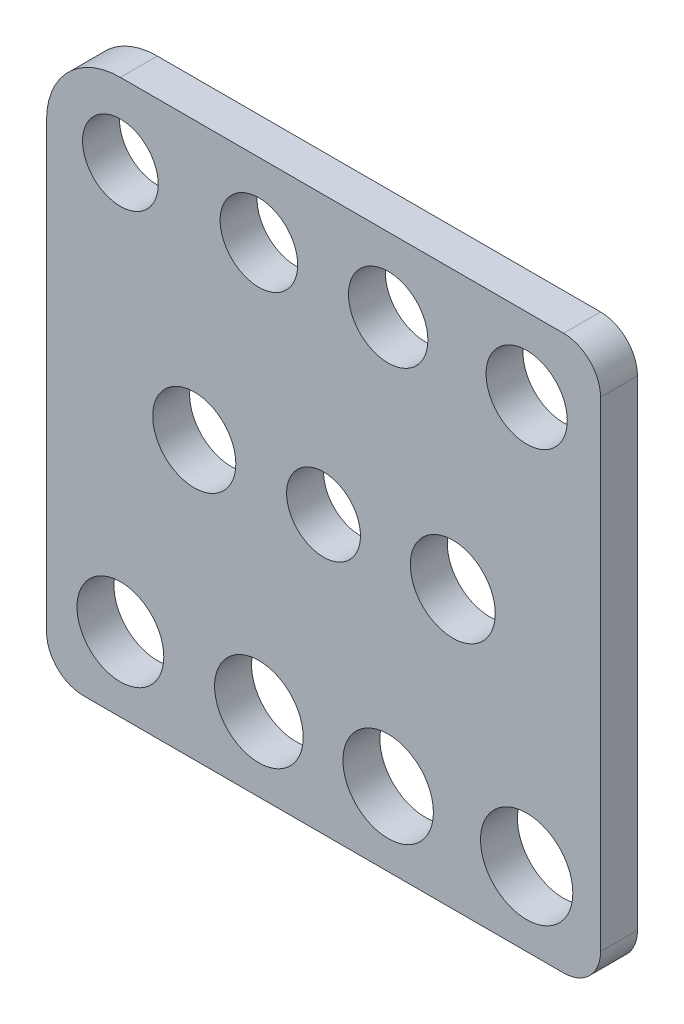
ISO-10303-21;
HEADER;
FILE_DESCRIPTION(('STEP AP214'),'2;1');
FILE_NAME('part.step','',(''),(''),'','','');
FILE_SCHEMA(('AUTOMOTIVE_DESIGN { 1 0 10303 214 1 1 1 1 }'));
ENDSEC;
DATA;
#1=APPLICATION_CONTEXT('core data for automotive mechanical design processes');
#2=APPLICATION_PROTOCOL_DEFINITION('international standard','automotive_design',2000,#1);
#3=PRODUCT_CONTEXT('',#1,'mechanical');
#4=PRODUCT('Part','Part','',(#3));
#5=PRODUCT_RELATED_PRODUCT_CATEGORY('part','',(#4));
#6=PRODUCT_DEFINITION_FORMATION('','',#4);
#7=PRODUCT_DEFINITION_CONTEXT('part definition',#1,'design');
#8=PRODUCT_DEFINITION('design','',#6,#7);
#9=PRODUCT_DEFINITION_SHAPE('','',#8);
#10=(LENGTH_UNIT() NAMED_UNIT(*) SI_UNIT(.MILLI.,.METRE.));
#11=(NAMED_UNIT(*) PLANE_ANGLE_UNIT() SI_UNIT($,.RADIAN.));
#12=(NAMED_UNIT(*) SI_UNIT($,.STERADIAN.) SOLID_ANGLE_UNIT());
#13=UNCERTAINTY_MEASURE_WITH_UNIT(LENGTH_MEASURE(1.E-05),#10,'distance_accuracy_value','');
#14=(GEOMETRIC_REPRESENTATION_CONTEXT(3) GLOBAL_UNCERTAINTY_ASSIGNED_CONTEXT((#13)) GLOBAL_UNIT_ASSIGNED_CONTEXT((#10,
#11,#12)) REPRESENTATION_CONTEXT('',''));
#15=CARTESIAN_POINT('',(0.,0.,0.));
#16=DIRECTION('',(0.,0.,1.));
#17=DIRECTION('',(1.,0.,0.));
#18=AXIS2_PLACEMENT_3D('',#15,#16,#17);
#19=CARTESIAN_POINT('',(-84.9572624856877,43.7175924462661,2.));
#20=DIRECTION('',(0.,0.,-1.));
#21=DIRECTION('',(-1.,0.,0.));
#22=AXIS2_PLACEMENT_3D('',#19,#20,#21);
#23=PLANE('',#22);
#24=CARTESIAN_POINT('',(-84.9572624856877,43.7175924462661,2.));
#25=DIRECTION('',(0.,0.,1.));
#26=DIRECTION('',(-1.,0.,0.));
#27=AXIS2_PLACEMENT_3D('',#24,#25,#26);
#28=CIRCLE('',#27,4.);
#29=CARTESIAN_POINT('',(-84.9572624856877,47.7175924462661,2.));
#30=VERTEX_POINT('',#29);
#31=CARTESIAN_POINT('',(-88.9572624856877,43.7175924462661,2.));
#32=VERTEX_POINT('',#31);
#33=EDGE_CURVE('E145',#30,#32,#28,.T.);
#34=ORIENTED_EDGE('',*,*,#33,.T.);
#35=DIRECTION('',(0.,-1.,0.));
#36=VECTOR('',#35,1.);
#37=CARTESIAN_POINT('',(-88.9572624856877,43.7175924462661,2.));
#38=LINE('',#37,#36);
#39=CARTESIAN_POINT('',(-88.9572624856877,19.7175924462661,2.));
#40=VERTEX_POINT('',#39);
#41=EDGE_CURVE('E93',#32,#40,#38,.T.);
#42=ORIENTED_EDGE('',*,*,#41,.T.);
#43=CARTESIAN_POINT('',(-86.9572624856877,19.7175924462661,2.));
#44=DIRECTION('',(0.,0.,1.));
#45=DIRECTION('',(1.,0.,0.));
#46=AXIS2_PLACEMENT_3D('',#43,#44,#45);
#47=CIRCLE('',#46,1.99999999999999);
#48=CARTESIAN_POINT('',(-86.9572624856877,17.7175924462661,2.));
#49=VERTEX_POINT('',#48);
#50=EDGE_CURVE('E160',#40,#49,#47,.T.);
#51=ORIENTED_EDGE('',*,*,#50,.T.);
#52=DIRECTION('',(1.,0.,0.));
#53=VECTOR('',#52,1.);
#54=CARTESIAN_POINT('',(-86.9572624856877,17.7175924462661,2.));
#55=LINE('',#54,#53);
#56=CARTESIAN_POINT('',(-60.9572624856877,17.7175924462661,2.));
#57=VERTEX_POINT('',#56);
#58=EDGE_CURVE('E173',#49,#57,#55,.T.);
#59=ORIENTED_EDGE('',*,*,#58,.T.);
#60=CARTESIAN_POINT('',(-60.9572624856877,19.7175924462661,2.));
#61=DIRECTION('',(0.,0.,1.));
#62=DIRECTION('',(1.,0.,0.));
#63=AXIS2_PLACEMENT_3D('',#60,#61,#62);
#64=CIRCLE('',#63,2.00000000000001);
#65=CARTESIAN_POINT('',(-58.9572624856877,19.7175924462661,2.));
#66=VERTEX_POINT('',#65);
#67=EDGE_CURVE('E112',#57,#66,#64,.T.);
#68=ORIENTED_EDGE('',*,*,#67,.T.);
#69=DIRECTION('',(0.,1.,0.));
#70=VECTOR('',#69,1.);
#71=CARTESIAN_POINT('',(-58.9572624856877,45.7175924462661,2.));
#72=LINE('',#71,#70);
#73=CARTESIAN_POINT('',(-58.9572624856877,45.7175924462661,2.));
#74=VERTEX_POINT('',#73);
#75=EDGE_CURVE('E106',#66,#74,#72,.T.);
#76=ORIENTED_EDGE('',*,*,#75,.T.);
#77=CARTESIAN_POINT('',(-60.9572624856877,45.7175924462661,2.));
#78=DIRECTION('',(0.,0.,1.));
#79=DIRECTION('',(-1.,0.,0.));
#80=AXIS2_PLACEMENT_3D('',#77,#78,#79);
#81=CIRCLE('',#80,2.00000000000001);
#82=CARTESIAN_POINT('',(-60.9572624856877,47.7175924462661,2.));
#83=VERTEX_POINT('',#82);
#84=EDGE_CURVE('E110',#74,#83,#81,.T.);
#85=ORIENTED_EDGE('',*,*,#84,.T.);
#86=DIRECTION('',(-1.,0.,0.));
#87=VECTOR('',#86,1.);
#88=CARTESIAN_POINT('',(-84.9572624856877,47.7175924462661,2.));
#89=LINE('',#88,#87);
#90=EDGE_CURVE('E50',#83,#30,#89,.T.);
#91=ORIENTED_EDGE('',*,*,#90,.T.);
#92=EDGE_LOOP('',(#34,#42,#51,#59,#68,#76,#85,#91));
#93=FACE_BOUND('',#92,.T.);
#94=CARTESIAN_POINT('',(-62.9572624856877,43.7175924462661,2.));
#95=DIRECTION('',(0.,0.,1.));
#96=DIRECTION('',(1.,0.,0.));
#97=AXIS2_PLACEMENT_3D('',#94,#95,#96);
#98=CIRCLE('',#97,2.2);
#99=CARTESIAN_POINT('',(-60.7572624856877,43.7175924462661,2.));
#100=VERTEX_POINT('',#99);
#101=EDGE_CURVE('E134',#100,#100,#98,.T.);
#102=ORIENTED_EDGE('',*,*,#101,.F.);
#103=EDGE_LOOP('',(#102));
#104=FACE_BOUND('',#103,.T.);
#105=CARTESIAN_POINT('',(-62.9572624856877,21.7175924462661,2.));
#106=DIRECTION('',(0.,0.,1.));
#107=DIRECTION('',(1.,0.,0.));
#108=AXIS2_PLACEMENT_3D('',#105,#106,#107);
#109=CIRCLE('',#108,2.49999999999999);
#110=CARTESIAN_POINT('',(-60.4572624856877,21.7175924462661,2.));
#111=VERTEX_POINT('',#110);
#112=EDGE_CURVE('E182',#111,#111,#109,.T.);
#113=ORIENTED_EDGE('',*,*,#112,.F.);
#114=EDGE_LOOP('',(#113));
#115=FACE_BOUND('',#114,.T.);
#116=CARTESIAN_POINT('',(-84.9572624856877,21.7175924462661,2.));
#117=DIRECTION('',(0.,0.,1.));
#118=DIRECTION('',(1.,0.,0.));
#119=AXIS2_PLACEMENT_3D('',#116,#117,#118);
#120=CIRCLE('',#119,2.35);
#121=CARTESIAN_POINT('',(-82.6072624856877,21.7175924462661,2.));
#122=VERTEX_POINT('',#121);
#123=EDGE_CURVE('E188',#122,#122,#120,.T.);
#124=ORIENTED_EDGE('',*,*,#123,.F.);
#125=EDGE_LOOP('',(#124));
#126=FACE_BOUND('',#125,.T.);
#127=CARTESIAN_POINT('',(-84.9572624856877,43.7175924462661,2.));
#128=DIRECTION('',(0.,0.,1.));
#129=DIRECTION('',(1.,0.,0.));
#130=AXIS2_PLACEMENT_3D('',#127,#128,#129);
#131=CIRCLE('',#130,2.04999999999999);
#132=CARTESIAN_POINT('',(-82.9072624856877,43.7175924462661,2.));
#133=VERTEX_POINT('',#132);
#134=EDGE_CURVE('E194',#133,#133,#131,.T.);
#135=ORIENTED_EDGE('',*,*,#134,.F.);
#136=EDGE_LOOP('',(#135));
#137=FACE_BOUND('',#136,.T.);
#138=CARTESIAN_POINT('',(-77.4572635149065,43.7215216040309,2.));
#139=DIRECTION('',(0.,0.,1.));
#140=DIRECTION('',(1.,0.,0.));
#141=AXIS2_PLACEMENT_3D('',#138,#139,#140);
#142=CIRCLE('',#141,2.1);
#143=CARTESIAN_POINT('',(-75.3572635149065,43.7215216040309,2.));
#144=VERTEX_POINT('',#143);
#145=EDGE_CURVE('E200',#144,#144,#142,.T.);
#146=ORIENTED_EDGE('',*,*,#145,.F.);
#147=EDGE_LOOP('',(#146));
#148=FACE_BOUND('',#147,.T.);
#149=CARTESIAN_POINT('',(-70.4572611381888,43.7220882756085,2.));
#150=DIRECTION('',(0.,0.,1.));
#151=DIRECTION('',(1.,0.,0.));
#152=AXIS2_PLACEMENT_3D('',#149,#150,#151);
#153=CIRCLE('',#152,2.15);
#154=CARTESIAN_POINT('',(-68.3072611381888,43.7220882756085,2.));
#155=VERTEX_POINT('',#154);
#156=EDGE_CURVE('E206',#155,#155,#153,.T.);
#157=ORIENTED_EDGE('',*,*,#156,.F.);
#158=EDGE_LOOP('',(#157));
#159=FACE_BOUND('',#158,.T.);
#160=CARTESIAN_POINT('',(-77.4572635149065,21.7215216040309,2.));
#161=DIRECTION('',(0.,0.,1.));
#162=DIRECTION('',(1.,0.,0.));
#163=AXIS2_PLACEMENT_3D('',#160,#161,#162);
#164=CIRCLE('',#163,2.4);
#165=CARTESIAN_POINT('',(-75.0572635149065,21.7215216040309,2.));
#166=VERTEX_POINT('',#165);
#167=EDGE_CURVE('E212',#166,#166,#164,.T.);
#168=ORIENTED_EDGE('',*,*,#167,.F.);
#169=EDGE_LOOP('',(#168));
#170=FACE_BOUND('',#169,.T.);
#171=CARTESIAN_POINT('',(-70.4572611381888,21.7220882756085,2.));
#172=DIRECTION('',(0.,0.,1.));
#173=DIRECTION('',(1.,0.,0.));
#174=AXIS2_PLACEMENT_3D('',#171,#172,#173);
#175=CIRCLE('',#174,2.45);
#176=CARTESIAN_POINT('',(-68.0072611381888,21.7220882756085,2.));
#177=VERTEX_POINT('',#176);
#178=EDGE_CURVE('E218',#177,#177,#175,.T.);
#179=ORIENTED_EDGE('',*,*,#178,.F.);
#180=EDGE_LOOP('',(#179));
#181=FACE_BOUND('',#180,.T.);
#182=CARTESIAN_POINT('',(-80.9572624856877,32.7175924462661,2.));
#183=DIRECTION('',(0.,0.,1.));
#184=DIRECTION('',(1.,0.,0.));
#185=AXIS2_PLACEMENT_3D('',#182,#183,#184);
#186=CIRCLE('',#185,2.25);
#187=CARTESIAN_POINT('',(-78.7072624856877,32.7175924462661,2.));
#188=VERTEX_POINT('',#187);
#189=EDGE_CURVE('E224',#188,#188,#186,.T.);
#190=ORIENTED_EDGE('',*,*,#189,.F.);
#191=EDGE_LOOP('',(#190));
#192=FACE_BOUND('',#191,.T.);
#193=CARTESIAN_POINT('',(-66.9572624856877,32.7175924462661,2.));
#194=DIRECTION('',(0.,0.,1.));
#195=DIRECTION('',(1.,0.,0.));
#196=AXIS2_PLACEMENT_3D('',#193,#194,#195);
#197=CIRCLE('',#196,2.29999999999999);
#198=CARTESIAN_POINT('',(-64.6572624856877,32.7175924462661,2.));
#199=VERTEX_POINT('',#198);
#200=EDGE_CURVE('E230',#199,#199,#197,.T.);
#201=ORIENTED_EDGE('',*,*,#200,.F.);
#202=EDGE_LOOP('',(#201));
#203=FACE_BOUND('',#202,.T.);
#204=CARTESIAN_POINT('',(-73.9572624856877,32.7175924462661,2.));
#205=DIRECTION('',(0.,0.,1.));
#206=DIRECTION('',(1.,0.,0.));
#207=AXIS2_PLACEMENT_3D('',#204,#205,#206);
#208=CIRCLE('',#207,2.);
#209=CARTESIAN_POINT('',(-71.9572624856877,32.7175924462661,2.));
#210=VERTEX_POINT('',#209);
#211=EDGE_CURVE('E236',#210,#210,#208,.T.);
#212=ORIENTED_EDGE('',*,*,#211,.F.);
#213=EDGE_LOOP('',(#212));
#214=FACE_BOUND('',#213,.T.);
#215=ADVANCED_FACE('F33',(#93,#104,#115,#126,#137,#148,#159,#170,#181,#192,#203,#214),#23,.F.);
#216=CARTESIAN_POINT('',(-84.9572624856877,43.7175924462661,0.));
#217=DIRECTION('',(0.,0.,-1.));
#218=DIRECTION('',(-1.,0.,0.));
#219=AXIS2_PLACEMENT_3D('',#216,#217,#218);
#220=PLANE('',#219);
#221=CARTESIAN_POINT('',(-66.9572624856877,32.7175924462661,0.));
#222=DIRECTION('',(0.,0.,1.));
#223=DIRECTION('',(1.,0.,0.));
#224=AXIS2_PLACEMENT_3D('',#221,#222,#223);
#225=CIRCLE('',#224,2.29999999999999);
#226=CARTESIAN_POINT('',(-64.6572624856877,32.7175924462661,0.));
#227=VERTEX_POINT('',#226);
#228=EDGE_CURVE('E233',#227,#227,#225,.T.);
#229=ORIENTED_EDGE('',*,*,#228,.T.);
#230=EDGE_LOOP('',(#229));
#231=FACE_BOUND('',#230,.T.);
#232=CARTESIAN_POINT('',(-70.4572611381888,21.7220882756085,0.));
#233=DIRECTION('',(0.,0.,1.));
#234=DIRECTION('',(1.,0.,0.));
#235=AXIS2_PLACEMENT_3D('',#232,#233,#234);
#236=CIRCLE('',#235,2.45);
#237=CARTESIAN_POINT('',(-68.0072611381888,21.7220882756085,0.));
#238=VERTEX_POINT('',#237);
#239=EDGE_CURVE('E221',#238,#238,#236,.T.);
#240=ORIENTED_EDGE('',*,*,#239,.T.);
#241=EDGE_LOOP('',(#240));
#242=FACE_BOUND('',#241,.T.);
#243=CARTESIAN_POINT('',(-70.4572611381888,43.7220882756085,0.));
#244=DIRECTION('',(0.,0.,1.));
#245=DIRECTION('',(1.,0.,0.));
#246=AXIS2_PLACEMENT_3D('',#243,#244,#245);
#247=CIRCLE('',#246,2.15);
#248=CARTESIAN_POINT('',(-68.3072611381888,43.7220882756085,0.));
#249=VERTEX_POINT('',#248);
#250=EDGE_CURVE('E209',#249,#249,#247,.T.);
#251=ORIENTED_EDGE('',*,*,#250,.T.);
#252=EDGE_LOOP('',(#251));
#253=FACE_BOUND('',#252,.T.);
#254=CARTESIAN_POINT('',(-84.9572624856877,43.7175924462661,0.));
#255=DIRECTION('',(0.,0.,1.));
#256=DIRECTION('',(1.,0.,0.));
#257=AXIS2_PLACEMENT_3D('',#254,#255,#256);
#258=CIRCLE('',#257,2.04999999999999);
#259=CARTESIAN_POINT('',(-82.9072624856877,43.7175924462661,0.));
#260=VERTEX_POINT('',#259);
#261=EDGE_CURVE('E197',#260,#260,#258,.T.);
#262=ORIENTED_EDGE('',*,*,#261,.T.);
#263=EDGE_LOOP('',(#262));
#264=FACE_BOUND('',#263,.T.);
#265=CARTESIAN_POINT('',(-62.9572624856877,21.7175924462661,0.));
#266=DIRECTION('',(0.,0.,1.));
#267=DIRECTION('',(1.,0.,0.));
#268=AXIS2_PLACEMENT_3D('',#265,#266,#267);
#269=CIRCLE('',#268,2.49999999999999);
#270=CARTESIAN_POINT('',(-60.4572624856877,21.7175924462661,0.));
#271=VERTEX_POINT('',#270);
#272=EDGE_CURVE('E185',#271,#271,#269,.T.);
#273=ORIENTED_EDGE('',*,*,#272,.T.);
#274=EDGE_LOOP('',(#273));
#275=FACE_BOUND('',#274,.T.);
#276=CARTESIAN_POINT('',(-84.9572624856877,43.7175924462661,0.));
#277=DIRECTION('',(0.,0.,1.));
#278=DIRECTION('',(-1.,0.,0.));
#279=AXIS2_PLACEMENT_3D('',#276,#277,#278);
#280=CIRCLE('',#279,4.);
#281=CARTESIAN_POINT('',(-84.9572624856877,47.7175924462661,0.));
#282=VERTEX_POINT('',#281);
#283=CARTESIAN_POINT('',(-88.9572624856877,43.7175924462661,0.));
#284=VERTEX_POINT('',#283);
#285=EDGE_CURVE('E130',#282,#284,#280,.T.);
#286=ORIENTED_EDGE('',*,*,#285,.F.);
#287=DIRECTION('',(-1.,0.,0.));
#288=VECTOR('',#287,1.);
#289=CARTESIAN_POINT('',(-84.9572624856877,47.7175924462661,0.));
#290=LINE('',#289,#288);
#291=CARTESIAN_POINT('',(-60.9572624856877,47.7175924462661,0.));
#292=VERTEX_POINT('',#291);
#293=EDGE_CURVE('E85',#292,#282,#290,.T.);
#294=ORIENTED_EDGE('',*,*,#293,.F.);
#295=CARTESIAN_POINT('',(-60.9572624856877,45.7175924462661,0.));
#296=DIRECTION('',(0.,0.,1.));
#297=DIRECTION('',(-1.,0.,0.));
#298=AXIS2_PLACEMENT_3D('',#295,#296,#297);
#299=CIRCLE('',#298,2.00000000000001);
#300=CARTESIAN_POINT('',(-58.9572624856877,45.7175924462661,0.));
#301=VERTEX_POINT('',#300);
#302=EDGE_CURVE('E79',#301,#292,#299,.T.);
#303=ORIENTED_EDGE('',*,*,#302,.F.);
#304=DIRECTION('',(0.,1.,0.));
#305=VECTOR('',#304,1.);
#306=CARTESIAN_POINT('',(-58.9572624856877,45.7175924462661,0.));
#307=LINE('',#306,#305);
#308=CARTESIAN_POINT('',(-58.9572624856877,19.7175924462661,0.));
#309=VERTEX_POINT('',#308);
#310=EDGE_CURVE('E120',#309,#301,#307,.T.);
#311=ORIENTED_EDGE('',*,*,#310,.F.);
#312=CARTESIAN_POINT('',(-60.9572624856877,19.7175924462661,0.));
#313=DIRECTION('',(0.,0.,1.));
#314=DIRECTION('',(1.,0.,0.));
#315=AXIS2_PLACEMENT_3D('',#312,#313,#314);
#316=CIRCLE('',#315,2.00000000000001);
#317=CARTESIAN_POINT('',(-60.9572624856877,17.7175924462661,0.));
#318=VERTEX_POINT('',#317);
#319=EDGE_CURVE('E140',#318,#309,#316,.T.);
#320=ORIENTED_EDGE('',*,*,#319,.F.);
#321=DIRECTION('',(1.,0.,0.));
#322=VECTOR('',#321,1.);
#323=CARTESIAN_POINT('',(-86.9572624856877,17.7175924462661,0.));
#324=LINE('',#323,#322);
#325=CARTESIAN_POINT('',(-86.9572624856877,17.7175924462661,0.));
#326=VERTEX_POINT('',#325);
#327=EDGE_CURVE('E138',#326,#318,#324,.T.);
#328=ORIENTED_EDGE('',*,*,#327,.F.);
#329=CARTESIAN_POINT('',(-86.9572624856877,19.7175924462661,0.));
#330=DIRECTION('',(0.,0.,1.));
#331=DIRECTION('',(1.,0.,0.));
#332=AXIS2_PLACEMENT_3D('',#329,#330,#331);
#333=CIRCLE('',#332,1.99999999999999);
#334=CARTESIAN_POINT('',(-88.9572624856877,19.7175924462661,0.));
#335=VERTEX_POINT('',#334);
#336=EDGE_CURVE('E136',#335,#326,#333,.T.);
#337=ORIENTED_EDGE('',*,*,#336,.F.);
#338=DIRECTION('',(0.,-1.,0.));
#339=VECTOR('',#338,1.);
#340=CARTESIAN_POINT('',(-88.9572624856877,43.7175924462661,0.));
#341=LINE('',#340,#339);
#342=EDGE_CURVE('E133',#284,#335,#341,.T.);
#343=ORIENTED_EDGE('',*,*,#342,.F.);
#344=EDGE_LOOP('',(#286,#294,#303,#311,#320,#328,#337,#343));
#345=FACE_BOUND('',#344,.T.);
#346=CARTESIAN_POINT('',(-62.9572624856877,43.7175924462661,0.));
#347=DIRECTION('',(0.,0.,1.));
#348=DIRECTION('',(1.,0.,0.));
#349=AXIS2_PLACEMENT_3D('',#346,#347,#348);
#350=CIRCLE('',#349,2.2);
#351=CARTESIAN_POINT('',(-60.7572624856877,43.7175924462661,0.));
#352=VERTEX_POINT('',#351);
#353=EDGE_CURVE('E179',#352,#352,#350,.T.);
#354=ORIENTED_EDGE('',*,*,#353,.T.);
#355=EDGE_LOOP('',(#354));
#356=FACE_BOUND('',#355,.T.);
#357=CARTESIAN_POINT('',(-84.9572624856877,21.7175924462661,0.));
#358=DIRECTION('',(0.,0.,1.));
#359=DIRECTION('',(1.,0.,0.));
#360=AXIS2_PLACEMENT_3D('',#357,#358,#359);
#361=CIRCLE('',#360,2.35);
#362=CARTESIAN_POINT('',(-82.6072624856877,21.7175924462661,0.));
#363=VERTEX_POINT('',#362);
#364=EDGE_CURVE('E191',#363,#363,#361,.T.);
#365=ORIENTED_EDGE('',*,*,#364,.T.);
#366=EDGE_LOOP('',(#365));
#367=FACE_BOUND('',#366,.T.);
#368=CARTESIAN_POINT('',(-77.4572635149065,43.7215216040309,0.));
#369=DIRECTION('',(0.,0.,1.));
#370=DIRECTION('',(1.,0.,0.));
#371=AXIS2_PLACEMENT_3D('',#368,#369,#370);
#372=CIRCLE('',#371,2.1);
#373=CARTESIAN_POINT('',(-75.3572635149065,43.7215216040309,0.));
#374=VERTEX_POINT('',#373);
#375=EDGE_CURVE('E203',#374,#374,#372,.T.);
#376=ORIENTED_EDGE('',*,*,#375,.T.);
#377=EDGE_LOOP('',(#376));
#378=FACE_BOUND('',#377,.T.);
#379=CARTESIAN_POINT('',(-77.4572635149065,21.7215216040309,0.));
#380=DIRECTION('',(0.,0.,1.));
#381=DIRECTION('',(1.,0.,0.));
#382=AXIS2_PLACEMENT_3D('',#379,#380,#381);
#383=CIRCLE('',#382,2.4);
#384=CARTESIAN_POINT('',(-75.0572635149065,21.7215216040309,0.));
#385=VERTEX_POINT('',#384);
#386=EDGE_CURVE('E215',#385,#385,#383,.T.);
#387=ORIENTED_EDGE('',*,*,#386,.T.);
#388=EDGE_LOOP('',(#387));
#389=FACE_BOUND('',#388,.T.);
#390=CARTESIAN_POINT('',(-80.9572624856877,32.7175924462661,0.));
#391=DIRECTION('',(0.,0.,1.));
#392=DIRECTION('',(1.,0.,0.));
#393=AXIS2_PLACEMENT_3D('',#390,#391,#392);
#394=CIRCLE('',#393,2.25);
#395=CARTESIAN_POINT('',(-78.7072624856877,32.7175924462661,0.));
#396=VERTEX_POINT('',#395);
#397=EDGE_CURVE('E227',#396,#396,#394,.T.);
#398=ORIENTED_EDGE('',*,*,#397,.T.);
#399=EDGE_LOOP('',(#398));
#400=FACE_BOUND('',#399,.T.);
#401=CARTESIAN_POINT('',(-73.9572624856877,32.7175924462661,0.));
#402=DIRECTION('',(0.,0.,1.));
#403=DIRECTION('',(1.,0.,0.));
#404=AXIS2_PLACEMENT_3D('',#401,#402,#403);
#405=CIRCLE('',#404,2.);
#406=CARTESIAN_POINT('',(-71.9572624856877,32.7175924462661,0.));
#407=VERTEX_POINT('',#406);
#408=EDGE_CURVE('E239',#407,#407,#405,.T.);
#409=ORIENTED_EDGE('',*,*,#408,.T.);
#410=EDGE_LOOP('',(#409));
#411=FACE_BOUND('',#410,.T.);
#412=ADVANCED_FACE('F164',(#231,#242,#253,#264,#275,#345,#356,#367,#378,#389,#400,#411),#220,.T.);
#413=CARTESIAN_POINT('',(-84.9572624856877,43.7175924462661,2.));
#414=DIRECTION('',(0.,0.,-1.));
#415=DIRECTION('',(-1.,0.,0.));
#416=AXIS2_PLACEMENT_3D('',#413,#414,#415);
#417=CYLINDRICAL_SURFACE('',#416,4.);
#418=ORIENTED_EDGE('',*,*,#285,.T.);
#419=DIRECTION('',(0.,0.,-1.));
#420=VECTOR('',#419,1.);
#421=CARTESIAN_POINT('',(-88.9572624856877,43.7175924462661,2.));
#422=LINE('',#421,#420);
#423=EDGE_CURVE('E11',#32,#284,#422,.T.);
#424=ORIENTED_EDGE('',*,*,#423,.F.);
#425=ORIENTED_EDGE('',*,*,#33,.F.);
#426=DIRECTION('',(0.,0.,-1.));
#427=VECTOR('',#426,1.);
#428=CARTESIAN_POINT('',(-84.9572624856877,47.7175924462661,2.));
#429=LINE('',#428,#427);
#430=EDGE_CURVE('E126',#30,#282,#429,.T.);
#431=ORIENTED_EDGE('',*,*,#430,.T.);
#432=EDGE_LOOP('',(#418,#424,#425,#431));
#433=FACE_BOUND('',#432,.T.);
#434=ADVANCED_FACE('F35',(#433),#417,.T.);
#435=CARTESIAN_POINT('',(-88.9572624856877,43.7175924462661,2.));
#436=DIRECTION('',(1.,0.,0.));
#437=DIRECTION('',(0.,0.,-1.));
#438=AXIS2_PLACEMENT_3D('',#435,#436,#437);
#439=PLANE('',#438);
#440=ORIENTED_EDGE('',*,*,#342,.T.);
#441=DIRECTION('',(0.,0.,-1.));
#442=VECTOR('',#441,1.);
#443=CARTESIAN_POINT('',(-88.9572624856877,19.7175924462661,2.));
#444=LINE('',#443,#442);
#445=EDGE_CURVE('E42',#40,#335,#444,.T.);
#446=ORIENTED_EDGE('',*,*,#445,.F.);
#447=ORIENTED_EDGE('',*,*,#41,.F.);
#448=ORIENTED_EDGE('',*,*,#423,.T.);
#449=EDGE_LOOP('',(#440,#446,#447,#448));
#450=FACE_BOUND('',#449,.T.);
#451=ADVANCED_FACE('F271',(#450),#439,.F.);
#452=CARTESIAN_POINT('',(-86.9572624856877,19.7175924462661,2.));
#453=DIRECTION('',(0.,0.,-1.));
#454=DIRECTION('',(-1.,0.,0.));
#455=AXIS2_PLACEMENT_3D('',#452,#453,#454);
#456=CYLINDRICAL_SURFACE('',#455,1.99999999999999);
#457=ORIENTED_EDGE('',*,*,#336,.T.);
#458=DIRECTION('',(0.,0.,-1.));
#459=VECTOR('',#458,1.);
#460=CARTESIAN_POINT('',(-86.9572624856877,17.7175924462661,2.));
#461=LINE('',#460,#459);
#462=EDGE_CURVE('E152',#49,#326,#461,.T.);
#463=ORIENTED_EDGE('',*,*,#462,.F.);
#464=ORIENTED_EDGE('',*,*,#50,.F.);
#465=ORIENTED_EDGE('',*,*,#445,.T.);
#466=EDGE_LOOP('',(#457,#463,#464,#465));
#467=FACE_BOUND('',#466,.T.);
#468=ADVANCED_FACE('F158',(#467),#456,.T.);
#469=CARTESIAN_POINT('',(-86.9572624856877,17.7175924462661,2.));
#470=DIRECTION('',(0.,1.,0.));
#471=DIRECTION('',(-1.,0.,0.));
#472=AXIS2_PLACEMENT_3D('',#469,#470,#471);
#473=PLANE('',#472);
#474=ORIENTED_EDGE('',*,*,#327,.T.);
#475=DIRECTION('',(0.,0.,-1.));
#476=VECTOR('',#475,1.);
#477=CARTESIAN_POINT('',(-60.9572624856877,17.7175924462661,2.));
#478=LINE('',#477,#476);
#479=EDGE_CURVE('E149',#57,#318,#478,.T.);
#480=ORIENTED_EDGE('',*,*,#479,.F.);
#481=ORIENTED_EDGE('',*,*,#58,.F.);
#482=ORIENTED_EDGE('',*,*,#462,.T.);
#483=EDGE_LOOP('',(#474,#480,#481,#482));
#484=FACE_BOUND('',#483,.T.);
#485=ADVANCED_FACE('F169',(#484),#473,.F.);
#486=CARTESIAN_POINT('',(-60.9572624856877,19.7175924462661,2.));
#487=DIRECTION('',(0.,0.,-1.));
#488=DIRECTION('',(-1.,0.,0.));
#489=AXIS2_PLACEMENT_3D('',#486,#487,#488);
#490=CYLINDRICAL_SURFACE('',#489,2.00000000000001);
#491=ORIENTED_EDGE('',*,*,#319,.T.);
#492=DIRECTION('',(0.,0.,-1.));
#493=VECTOR('',#492,1.);
#494=CARTESIAN_POINT('',(-58.9572624856877,19.7175924462661,2.));
#495=LINE('',#494,#493);
#496=EDGE_CURVE('E121',#66,#309,#495,.T.);
#497=ORIENTED_EDGE('',*,*,#496,.F.);
#498=ORIENTED_EDGE('',*,*,#67,.F.);
#499=ORIENTED_EDGE('',*,*,#479,.T.);
#500=EDGE_LOOP('',(#491,#497,#498,#499));
#501=FACE_BOUND('',#500,.T.);
#502=ADVANCED_FACE('F172',(#501),#490,.T.);
#503=CARTESIAN_POINT('',(-58.9572624856877,45.7175924462661,2.));
#504=DIRECTION('',(-1.,0.,0.));
#505=DIRECTION('',(0.,-1.,0.));
#506=AXIS2_PLACEMENT_3D('',#503,#504,#505);
#507=PLANE('',#506);
#508=ORIENTED_EDGE('',*,*,#310,.T.);
#509=DIRECTION('',(0.,0.,-1.));
#510=VECTOR('',#509,1.);
#511=CARTESIAN_POINT('',(-58.9572624856877,45.7175924462661,2.));
#512=LINE('',#511,#510);
#513=EDGE_CURVE('E117',#74,#301,#512,.T.);
#514=ORIENTED_EDGE('',*,*,#513,.F.);
#515=ORIENTED_EDGE('',*,*,#75,.F.);
#516=ORIENTED_EDGE('',*,*,#496,.T.);
#517=EDGE_LOOP('',(#508,#514,#515,#516));
#518=FACE_BOUND('',#517,.T.);
#519=ADVANCED_FACE('F118',(#518),#507,.F.);
#520=CARTESIAN_POINT('',(-60.9572624856877,45.7175924462661,2.));
#521=DIRECTION('',(0.,0.,-1.));
#522=DIRECTION('',(-1.,0.,0.));
#523=AXIS2_PLACEMENT_3D('',#520,#521,#522);
#524=CYLINDRICAL_SURFACE('',#523,2.00000000000001);
#525=ORIENTED_EDGE('',*,*,#302,.T.);
#526=DIRECTION('',(0.,0.,-1.));
#527=VECTOR('',#526,1.);
#528=CARTESIAN_POINT('',(-60.9572624856877,47.7175924462661,2.));
#529=LINE('',#528,#527);
#530=EDGE_CURVE('E122',#83,#292,#529,.T.);
#531=ORIENTED_EDGE('',*,*,#530,.F.);
#532=ORIENTED_EDGE('',*,*,#84,.F.);
#533=ORIENTED_EDGE('',*,*,#513,.T.);
#534=EDGE_LOOP('',(#525,#531,#532,#533));
#535=FACE_BOUND('',#534,.T.);
#536=ADVANCED_FACE('F124',(#535),#524,.T.);
#537=CARTESIAN_POINT('',(-84.9572624856877,47.7175924462661,2.));
#538=DIRECTION('',(0.,-1.,0.));
#539=DIRECTION('',(1.,0.,0.));
#540=AXIS2_PLACEMENT_3D('',#537,#538,#539);
#541=PLANE('',#540);
#542=ORIENTED_EDGE('',*,*,#293,.T.);
#543=ORIENTED_EDGE('',*,*,#430,.F.);
#544=ORIENTED_EDGE('',*,*,#90,.F.);
#545=ORIENTED_EDGE('',*,*,#530,.T.);
#546=EDGE_LOOP('',(#542,#543,#544,#545));
#547=FACE_BOUND('',#546,.T.);
#548=ADVANCED_FACE('F259',(#547),#541,.F.);
#549=CARTESIAN_POINT('',(-62.9572624856877,43.7175924462661,2.));
#550=DIRECTION('',(0.,0.,-1.));
#551=DIRECTION('',(-1.,0.,0.));
#552=AXIS2_PLACEMENT_3D('',#549,#550,#551);
#553=CYLINDRICAL_SURFACE('',#552,2.2);
#554=ORIENTED_EDGE('',*,*,#101,.T.);
#555=EDGE_LOOP('',(#554));
#556=FACE_BOUND('',#555,.T.);
#557=ORIENTED_EDGE('',*,*,#353,.F.);
#558=EDGE_LOOP('',(#557));
#559=FACE_BOUND('',#558,.T.);
#560=ADVANCED_FACE('F256',(#556,#559),#553,.F.);
#561=CARTESIAN_POINT('',(-62.9572624856877,21.7175924462661,2.));
#562=DIRECTION('',(0.,0.,-1.));
#563=DIRECTION('',(-1.,0.,0.));
#564=AXIS2_PLACEMENT_3D('',#561,#562,#563);
#565=CYLINDRICAL_SURFACE('',#564,2.49999999999999);
#566=ORIENTED_EDGE('',*,*,#112,.T.);
#567=EDGE_LOOP('',(#566));
#568=FACE_BOUND('',#567,.T.);
#569=ORIENTED_EDGE('',*,*,#272,.F.);
#570=EDGE_LOOP('',(#569));
#571=FACE_BOUND('',#570,.T.);
#572=ADVANCED_FACE('F335',(#568,#571),#565,.F.);
#573=CARTESIAN_POINT('',(-84.9572624856877,21.7175924462661,2.));
#574=DIRECTION('',(0.,0.,-1.));
#575=DIRECTION('',(-1.,0.,0.));
#576=AXIS2_PLACEMENT_3D('',#573,#574,#575);
#577=CYLINDRICAL_SURFACE('',#576,2.35);
#578=ORIENTED_EDGE('',*,*,#123,.T.);
#579=EDGE_LOOP('',(#578));
#580=FACE_BOUND('',#579,.T.);
#581=ORIENTED_EDGE('',*,*,#364,.F.);
#582=EDGE_LOOP('',(#581));
#583=FACE_BOUND('',#582,.T.);
#584=ADVANCED_FACE('F343',(#580,#583),#577,.F.);
#585=CARTESIAN_POINT('',(-84.9572624856877,43.7175924462661,2.));
#586=DIRECTION('',(0.,0.,-1.));
#587=DIRECTION('',(-1.,0.,0.));
#588=AXIS2_PLACEMENT_3D('',#585,#586,#587);
#589=CYLINDRICAL_SURFACE('',#588,2.04999999999999);
#590=ORIENTED_EDGE('',*,*,#134,.T.);
#591=EDGE_LOOP('',(#590));
#592=FACE_BOUND('',#591,.T.);
#593=ORIENTED_EDGE('',*,*,#261,.F.);
#594=EDGE_LOOP('',(#593));
#595=FACE_BOUND('',#594,.T.);
#596=ADVANCED_FACE('F351',(#592,#595),#589,.F.);
#597=CARTESIAN_POINT('',(-77.4572635149065,43.7215216040309,2.));
#598=DIRECTION('',(0.,0.,-1.));
#599=DIRECTION('',(-1.,0.,0.));
#600=AXIS2_PLACEMENT_3D('',#597,#598,#599);
#601=CYLINDRICAL_SURFACE('',#600,2.1);
#602=ORIENTED_EDGE('',*,*,#145,.T.);
#603=EDGE_LOOP('',(#602));
#604=FACE_BOUND('',#603,.T.);
#605=ORIENTED_EDGE('',*,*,#375,.F.);
#606=EDGE_LOOP('',(#605));
#607=FACE_BOUND('',#606,.T.);
#608=ADVANCED_FACE('F360',(#604,#607),#601,.F.);
#609=CARTESIAN_POINT('',(-70.4572611381888,43.7220882756085,2.));
#610=DIRECTION('',(0.,0.,-1.));
#611=DIRECTION('',(-1.,0.,0.));
#612=AXIS2_PLACEMENT_3D('',#609,#610,#611);
#613=CYLINDRICAL_SURFACE('',#612,2.15);
#614=ORIENTED_EDGE('',*,*,#156,.T.);
#615=EDGE_LOOP('',(#614));
#616=FACE_BOUND('',#615,.T.);
#617=ORIENTED_EDGE('',*,*,#250,.F.);
#618=EDGE_LOOP('',(#617));
#619=FACE_BOUND('',#618,.T.);
#620=ADVANCED_FACE('F369',(#616,#619),#613,.F.);
#621=CARTESIAN_POINT('',(-77.4572635149065,21.7215216040309,2.));
#622=DIRECTION('',(0.,0.,-1.));
#623=DIRECTION('',(-1.,0.,0.));
#624=AXIS2_PLACEMENT_3D('',#621,#622,#623);
#625=CYLINDRICAL_SURFACE('',#624,2.4);
#626=ORIENTED_EDGE('',*,*,#167,.T.);
#627=EDGE_LOOP('',(#626));
#628=FACE_BOUND('',#627,.T.);
#629=ORIENTED_EDGE('',*,*,#386,.F.);
#630=EDGE_LOOP('',(#629));
#631=FACE_BOUND('',#630,.T.);
#632=ADVANCED_FACE('F378',(#628,#631),#625,.F.);
#633=CARTESIAN_POINT('',(-70.4572611381888,21.7220882756085,2.));
#634=DIRECTION('',(0.,0.,-1.));
#635=DIRECTION('',(-1.,0.,0.));
#636=AXIS2_PLACEMENT_3D('',#633,#634,#635);
#637=CYLINDRICAL_SURFACE('',#636,2.45);
#638=ORIENTED_EDGE('',*,*,#178,.T.);
#639=EDGE_LOOP('',(#638));
#640=FACE_BOUND('',#639,.T.);
#641=ORIENTED_EDGE('',*,*,#239,.F.);
#642=EDGE_LOOP('',(#641));
#643=FACE_BOUND('',#642,.T.);
#644=ADVANCED_FACE('F387',(#640,#643),#637,.F.);
#645=CARTESIAN_POINT('',(-80.9572624856877,32.7175924462661,2.));
#646=DIRECTION('',(0.,0.,-1.));
#647=DIRECTION('',(-1.,0.,0.));
#648=AXIS2_PLACEMENT_3D('',#645,#646,#647);
#649=CYLINDRICAL_SURFACE('',#648,2.25);
#650=ORIENTED_EDGE('',*,*,#189,.T.);
#651=EDGE_LOOP('',(#650));
#652=FACE_BOUND('',#651,.T.);
#653=ORIENTED_EDGE('',*,*,#397,.F.);
#654=EDGE_LOOP('',(#653));
#655=FACE_BOUND('',#654,.T.);
#656=ADVANCED_FACE('F396',(#652,#655),#649,.F.);
#657=CARTESIAN_POINT('',(-66.9572624856877,32.7175924462661,2.));
#658=DIRECTION('',(0.,0.,-1.));
#659=DIRECTION('',(-1.,0.,0.));
#660=AXIS2_PLACEMENT_3D('',#657,#658,#659);
#661=CYLINDRICAL_SURFACE('',#660,2.29999999999999);
#662=ORIENTED_EDGE('',*,*,#200,.T.);
#663=EDGE_LOOP('',(#662));
#664=FACE_BOUND('',#663,.T.);
#665=ORIENTED_EDGE('',*,*,#228,.F.);
#666=EDGE_LOOP('',(#665));
#667=FACE_BOUND('',#666,.T.);
#668=ADVANCED_FACE('F405',(#664,#667),#661,.F.);
#669=CARTESIAN_POINT('',(-73.9572624856877,32.7175924462661,2.));
#670=DIRECTION('',(0.,0.,-1.));
#671=DIRECTION('',(-1.,0.,0.));
#672=AXIS2_PLACEMENT_3D('',#669,#670,#671);
#673=CYLINDRICAL_SURFACE('',#672,2.);
#674=ORIENTED_EDGE('',*,*,#211,.T.);
#675=EDGE_LOOP('',(#674));
#676=FACE_BOUND('',#675,.T.);
#677=ORIENTED_EDGE('',*,*,#408,.F.);
#678=EDGE_LOOP('',(#677));
#679=FACE_BOUND('',#678,.T.);
#680=ADVANCED_FACE('F245',(#676,#679),#673,.F.);
#681=CLOSED_SHELL('',(#215,#412,#434,#451,#468,#485,#502,#519,#536,#548,#560,#572,#584,#596,
#608,#620,#632,#644,#656,#668,#680));
#682=MANIFOLD_SOLID_BREP('B2',#681);
#683=ADVANCED_BREP_SHAPE_REPRESENTATION('',(#18,#682),#14);
#684=SHAPE_DEFINITION_REPRESENTATION(#9,#683);
ENDSEC;
END-ISO-10303-21;
